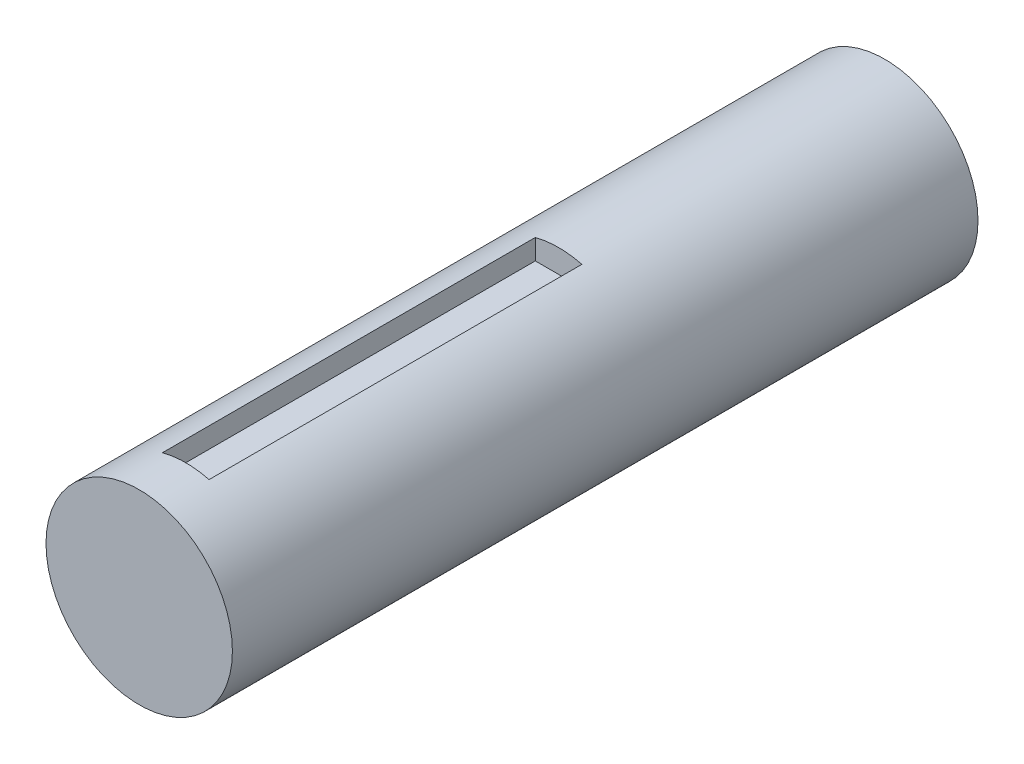
ISO-10303-21;
HEADER;
FILE_DESCRIPTION(('STEP AP214'),'2;1');
FILE_NAME('part.step','',(''),(''),'','','');
FILE_SCHEMA(('AUTOMOTIVE_DESIGN { 1 0 10303 214 1 1 1 1 }'));
ENDSEC;
DATA;
#1=APPLICATION_CONTEXT('core data for automotive mechanical design processes');
#2=APPLICATION_PROTOCOL_DEFINITION('international standard','automotive_design',2000,#1);
#3=PRODUCT_CONTEXT('',#1,'mechanical');
#4=PRODUCT('Part','Part','',(#3));
#5=PRODUCT_RELATED_PRODUCT_CATEGORY('part','',(#4));
#6=PRODUCT_DEFINITION_FORMATION('','',#4);
#7=PRODUCT_DEFINITION_CONTEXT('part definition',#1,'design');
#8=PRODUCT_DEFINITION('design','',#6,#7);
#9=PRODUCT_DEFINITION_SHAPE('','',#8);
#10=(LENGTH_UNIT() NAMED_UNIT(*) SI_UNIT(.MILLI.,.METRE.));
#11=(NAMED_UNIT(*) PLANE_ANGLE_UNIT() SI_UNIT($,.RADIAN.));
#12=(NAMED_UNIT(*) SI_UNIT($,.STERADIAN.) SOLID_ANGLE_UNIT());
#13=UNCERTAINTY_MEASURE_WITH_UNIT(LENGTH_MEASURE(1.E-05),#10,'distance_accuracy_value','');
#14=(GEOMETRIC_REPRESENTATION_CONTEXT(3) GLOBAL_UNCERTAINTY_ASSIGNED_CONTEXT((#13)) GLOBAL_UNIT_ASSIGNED_CONTEXT((#10,
#11,#12)) REPRESENTATION_CONTEXT('',''));
#15=CARTESIAN_POINT('',(0.,0.,0.));
#16=DIRECTION('',(0.,0.,1.));
#17=DIRECTION('',(1.,0.,0.));
#18=AXIS2_PLACEMENT_3D('',#15,#16,#17);
#19=CARTESIAN_POINT('',(0.,0.,80.));
#20=DIRECTION('',(0.,0.,-1.));
#21=DIRECTION('',(-1.,0.,0.));
#22=AXIS2_PLACEMENT_3D('',#19,#20,#21);
#23=CYLINDRICAL_SURFACE('',#22,10.);
#24=CARTESIAN_POINT('',(0.,0.,0.));
#25=DIRECTION('',(0.,0.,1.));
#26=DIRECTION('',(1.,0.,0.));
#27=AXIS2_PLACEMENT_3D('',#24,#25,#26);
#28=CIRCLE('',#27,10.);
#29=CARTESIAN_POINT('',(10.,0.,0.));
#30=VERTEX_POINT('',#29);
#31=EDGE_CURVE('E91',#30,#30,#28,.T.);
#32=ORIENTED_EDGE('',*,*,#31,.T.);
#33=EDGE_LOOP('',(#32));
#34=FACE_BOUND('',#33,.T.);
#35=CARTESIAN_POINT('',(0.,0.,80.));
#36=DIRECTION('',(0.,0.,1.));
#37=DIRECTION('',(1.,0.,0.));
#38=AXIS2_PLACEMENT_3D('',#35,#36,#37);
#39=CIRCLE('',#38,10.);
#40=CARTESIAN_POINT('',(10.,0.,80.));
#41=VERTEX_POINT('',#40);
#42=EDGE_CURVE('E105',#41,#41,#39,.T.);
#43=ORIENTED_EDGE('',*,*,#42,.F.);
#44=EDGE_LOOP('',(#43));
#45=FACE_BOUND('',#44,.T.);
#46=CARTESIAN_POINT('',(0.,0.,35.));
#47=DIRECTION('',(0.,0.,1.));
#48=DIRECTION('',(1.,0.,0.));
#49=AXIS2_PLACEMENT_3D('',#46,#47,#48);
#50=CIRCLE('',#49,10.);
#51=CARTESIAN_POINT('',(2.5,9.68245836551854,35.));
#52=VERTEX_POINT('',#51);
#53=CARTESIAN_POINT('',(-2.5,9.68245836551854,35.));
#54=VERTEX_POINT('',#53);
#55=EDGE_CURVE('E11',#52,#54,#50,.T.);
#56=ORIENTED_EDGE('',*,*,#55,.F.);
#57=DIRECTION('',(0.,0.,-1.));
#58=VECTOR('',#57,1.);
#59=CARTESIAN_POINT('',(2.5,9.68245836551854,80.));
#60=LINE('',#59,#58);
#61=CARTESIAN_POINT('',(2.5,9.68245836551854,75.));
#62=VERTEX_POINT('',#61);
#63=EDGE_CURVE('E59',#62,#52,#60,.T.);
#64=ORIENTED_EDGE('',*,*,#63,.F.);
#65=CARTESIAN_POINT('',(0.,0.,75.));
#66=DIRECTION('',(0.,0.,1.));
#67=DIRECTION('',(1.,0.,0.));
#68=AXIS2_PLACEMENT_3D('',#65,#66,#67);
#69=CIRCLE('',#68,10.);
#70=CARTESIAN_POINT('',(-2.5,9.68245836551854,75.));
#71=VERTEX_POINT('',#70);
#72=EDGE_CURVE('E108',#62,#71,#69,.T.);
#73=ORIENTED_EDGE('',*,*,#72,.T.);
#74=DIRECTION('',(0.,0.,-1.));
#75=VECTOR('',#74,1.);
#76=CARTESIAN_POINT('',(-2.5,9.68245836551854,80.));
#77=LINE('',#76,#75);
#78=EDGE_CURVE('E44',#54,#71,#77,.F.);
#79=ORIENTED_EDGE('',*,*,#78,.F.);
#80=EDGE_LOOP('',(#56,#64,#73,#79));
#81=FACE_BOUND('',#80,.T.);
#82=ADVANCED_FACE('F37',(#34,#45,#81),#23,.T.);
#83=CARTESIAN_POINT('',(0.,0.,80.));
#84=DIRECTION('',(0.,0.,1.));
#85=DIRECTION('',(1.,0.,0.));
#86=AXIS2_PLACEMENT_3D('',#83,#84,#85);
#87=PLANE('',#86);
#88=ORIENTED_EDGE('',*,*,#42,.T.);
#89=EDGE_LOOP('',(#88));
#90=FACE_BOUND('',#89,.T.);
#91=ADVANCED_FACE('F127',(#90),#87,.T.);
#92=CARTESIAN_POINT('',(0.,0.,0.));
#93=DIRECTION('',(0.,0.,1.));
#94=DIRECTION('',(1.,0.,0.));
#95=AXIS2_PLACEMENT_3D('',#92,#93,#94);
#96=PLANE('',#95);
#97=ORIENTED_EDGE('',*,*,#31,.F.);
#98=EDGE_LOOP('',(#97));
#99=FACE_BOUND('',#98,.T.);
#100=ADVANCED_FACE('F132',(#99),#96,.F.);
#101=CARTESIAN_POINT('',(-2.5,7.5,35.));
#102=DIRECTION('',(1.,0.,0.));
#103=DIRECTION('',(0.,0.,-1.));
#104=AXIS2_PLACEMENT_3D('',#101,#102,#103);
#105=PLANE('',#104);
#106=ORIENTED_EDGE('',*,*,#78,.T.);
#107=DIRECTION('',(0.,1.,0.));
#108=VECTOR('',#107,1.);
#109=CARTESIAN_POINT('',(-2.5,7.5,75.));
#110=LINE('',#109,#108);
#111=CARTESIAN_POINT('',(-2.5,7.5,75.));
#112=VERTEX_POINT('',#111);
#113=EDGE_CURVE('E51',#112,#71,#110,.T.);
#114=ORIENTED_EDGE('',*,*,#113,.F.);
#115=DIRECTION('',(0.,0.,1.));
#116=VECTOR('',#115,1.);
#117=CARTESIAN_POINT('',(-2.5,7.5,35.));
#118=LINE('',#117,#116);
#119=CARTESIAN_POINT('',(-2.5,7.5,35.));
#120=VERTEX_POINT('',#119);
#121=EDGE_CURVE('E92',#120,#112,#118,.T.);
#122=ORIENTED_EDGE('',*,*,#121,.F.);
#123=DIRECTION('',(0.,1.,0.));
#124=VECTOR('',#123,1.);
#125=CARTESIAN_POINT('',(-2.5,7.5,35.));
#126=LINE('',#125,#124);
#127=EDGE_CURVE('E84',#120,#54,#126,.T.);
#128=ORIENTED_EDGE('',*,*,#127,.T.);
#129=EDGE_LOOP('',(#106,#114,#122,#128));
#130=FACE_BOUND('',#129,.T.);
#131=ADVANCED_FACE('F115',(#130),#105,.T.);
#132=CARTESIAN_POINT('',(2.5,7.5,35.));
#133=DIRECTION('',(-1.,0.,0.));
#134=DIRECTION('',(0.,0.,1.));
#135=AXIS2_PLACEMENT_3D('',#132,#133,#134);
#136=PLANE('',#135);
#137=ORIENTED_EDGE('',*,*,#63,.T.);
#138=DIRECTION('',(0.,-1.,0.));
#139=VECTOR('',#138,1.);
#140=CARTESIAN_POINT('',(2.5,7.5,35.));
#141=LINE('',#140,#139);
#142=CARTESIAN_POINT('',(2.5,7.5,35.));
#143=VERTEX_POINT('',#142);
#144=EDGE_CURVE('E75',#52,#143,#141,.T.);
#145=ORIENTED_EDGE('',*,*,#144,.T.);
#146=DIRECTION('',(0.,0.,1.));
#147=VECTOR('',#146,1.);
#148=CARTESIAN_POINT('',(2.5,7.5,35.));
#149=LINE('',#148,#147);
#150=CARTESIAN_POINT('',(2.5,7.5,75.));
#151=VERTEX_POINT('',#150);
#152=EDGE_CURVE('E78',#143,#151,#149,.T.);
#153=ORIENTED_EDGE('',*,*,#152,.T.);
#154=DIRECTION('',(0.,-1.,0.));
#155=VECTOR('',#154,1.);
#156=CARTESIAN_POINT('',(2.5,7.5,75.));
#157=LINE('',#156,#155);
#158=EDGE_CURVE('E102',#62,#151,#157,.T.);
#159=ORIENTED_EDGE('',*,*,#158,.F.);
#160=EDGE_LOOP('',(#137,#145,#153,#159));
#161=FACE_BOUND('',#160,.T.);
#162=ADVANCED_FACE('F77',(#161),#136,.T.);
#163=CARTESIAN_POINT('',(0.,0.,35.));
#164=DIRECTION('',(0.,0.,1.));
#165=DIRECTION('',(1.,0.,0.));
#166=AXIS2_PLACEMENT_3D('',#163,#164,#165);
#167=PLANE('',#166);
#168=ORIENTED_EDGE('',*,*,#55,.T.);
#169=ORIENTED_EDGE('',*,*,#127,.F.);
#170=DIRECTION('',(-1.,0.,0.));
#171=VECTOR('',#170,1.);
#172=CARTESIAN_POINT('',(2.5,7.5,35.));
#173=LINE('',#172,#171);
#174=EDGE_CURVE('E83',#143,#120,#173,.T.);
#175=ORIENTED_EDGE('',*,*,#174,.F.);
#176=ORIENTED_EDGE('',*,*,#144,.F.);
#177=EDGE_LOOP('',(#168,#169,#175,#176));
#178=FACE_BOUND('',#177,.T.);
#179=ADVANCED_FACE('F95',(#178),#167,.T.);
#180=CARTESIAN_POINT('',(0.,0.,75.));
#181=DIRECTION('',(0.,0.,1.));
#182=DIRECTION('',(1.,0.,0.));
#183=AXIS2_PLACEMENT_3D('',#180,#181,#182);
#184=PLANE('',#183);
#185=ORIENTED_EDGE('',*,*,#158,.T.);
#186=DIRECTION('',(-1.,0.,0.));
#187=VECTOR('',#186,1.);
#188=CARTESIAN_POINT('',(2.5,7.5,75.));
#189=LINE('',#188,#187);
#190=EDGE_CURVE('E90',#151,#112,#189,.T.);
#191=ORIENTED_EDGE('',*,*,#190,.T.);
#192=ORIENTED_EDGE('',*,*,#113,.T.);
#193=ORIENTED_EDGE('',*,*,#72,.F.);
#194=EDGE_LOOP('',(#185,#191,#192,#193));
#195=FACE_BOUND('',#194,.T.);
#196=ADVANCED_FACE('F117',(#195),#184,.F.);
#197=CARTESIAN_POINT('',(2.5,7.5,35.));
#198=DIRECTION('',(0.,1.,0.));
#199=DIRECTION('',(0.,0.,1.));
#200=AXIS2_PLACEMENT_3D('',#197,#198,#199);
#201=PLANE('',#200);
#202=ORIENTED_EDGE('',*,*,#190,.F.);
#203=ORIENTED_EDGE('',*,*,#152,.F.);
#204=ORIENTED_EDGE('',*,*,#174,.T.);
#205=ORIENTED_EDGE('',*,*,#121,.T.);
#206=EDGE_LOOP('',(#202,#203,#204,#205));
#207=FACE_BOUND('',#206,.T.);
#208=ADVANCED_FACE('F87',(#207),#201,.T.);
#209=CLOSED_SHELL('',(#82,#91,#100,#131,#162,#179,#196,#208));
#210=MANIFOLD_SOLID_BREP('B2',#209);
#211=ADVANCED_BREP_SHAPE_REPRESENTATION('',(#18,#210),#14);
#212=SHAPE_DEFINITION_REPRESENTATION(#9,#211);
ENDSEC;
END-ISO-10303-21;
